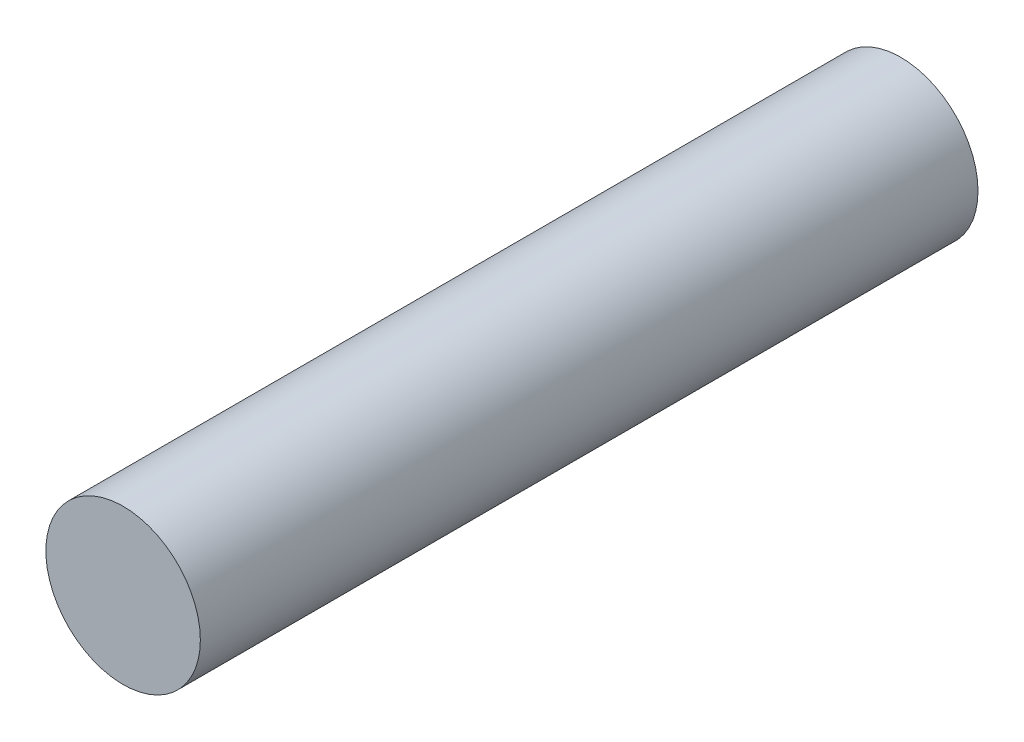
ISO-10303-21;
HEADER;
FILE_DESCRIPTION(('STEP AP214'),'2;1');
FILE_NAME('part.step','',(''),(''),'','','');
FILE_SCHEMA(('AUTOMOTIVE_DESIGN { 1 0 10303 214 1 1 1 1 }'));
ENDSEC;
DATA;
#1=APPLICATION_CONTEXT('core data for automotive mechanical design processes');
#2=APPLICATION_PROTOCOL_DEFINITION('international standard','automotive_design',2000,#1);
#3=PRODUCT_CONTEXT('',#1,'mechanical');
#4=PRODUCT('Part','Part','',(#3));
#5=PRODUCT_RELATED_PRODUCT_CATEGORY('part','',(#4));
#6=PRODUCT_DEFINITION_FORMATION('','',#4);
#7=PRODUCT_DEFINITION_CONTEXT('part definition',#1,'design');
#8=PRODUCT_DEFINITION('design','',#6,#7);
#9=PRODUCT_DEFINITION_SHAPE('','',#8);
#10=(LENGTH_UNIT() NAMED_UNIT(*) SI_UNIT(.MILLI.,.METRE.));
#11=(NAMED_UNIT(*) PLANE_ANGLE_UNIT() SI_UNIT($,.RADIAN.));
#12=(NAMED_UNIT(*) SI_UNIT($,.STERADIAN.) SOLID_ANGLE_UNIT());
#13=UNCERTAINTY_MEASURE_WITH_UNIT(LENGTH_MEASURE(1.E-05),#10,'distance_accuracy_value','');
#14=(GEOMETRIC_REPRESENTATION_CONTEXT(3) GLOBAL_UNCERTAINTY_ASSIGNED_CONTEXT((#13)) GLOBAL_UNIT_ASSIGNED_CONTEXT((#10,
#11,#12)) REPRESENTATION_CONTEXT('',''));
#15=CARTESIAN_POINT('',(0.,0.,0.));
#16=DIRECTION('',(0.,0.,1.));
#17=DIRECTION('',(1.,0.,0.));
#18=AXIS2_PLACEMENT_3D('',#15,#16,#17);
#19=CARTESIAN_POINT('',(0.,0.,15.));
#20=DIRECTION('',(0.,0.,-1.));
#21=DIRECTION('',(-1.,0.,0.));
#22=AXIS2_PLACEMENT_3D('',#19,#20,#21);
#23=CYLINDRICAL_SURFACE('',#22,1.49);
#24=CARTESIAN_POINT('',(0.,0.,15.));
#25=DIRECTION('',(0.,0.,1.));
#26=DIRECTION('',(1.,0.,0.));
#27=AXIS2_PLACEMENT_3D('',#24,#25,#26);
#28=CIRCLE('',#27,1.49);
#29=CARTESIAN_POINT('',(1.49,0.,15.));
#30=VERTEX_POINT('',#29);
#31=EDGE_CURVE('E10',#30,#30,#28,.T.);
#32=ORIENTED_EDGE('',*,*,#31,.F.);
#33=EDGE_LOOP('',(#32));
#34=FACE_BOUND('',#33,.T.);
#35=CARTESIAN_POINT('',(0.,0.,0.));
#36=DIRECTION('',(0.,0.,1.));
#37=DIRECTION('',(1.,0.,0.));
#38=AXIS2_PLACEMENT_3D('',#35,#36,#37);
#39=CIRCLE('',#38,1.49);
#40=CARTESIAN_POINT('',(1.49,0.,0.));
#41=VERTEX_POINT('',#40);
#42=EDGE_CURVE('E46',#41,#41,#39,.T.);
#43=ORIENTED_EDGE('',*,*,#42,.T.);
#44=EDGE_LOOP('',(#43));
#45=FACE_BOUND('',#44,.T.);
#46=ADVANCED_FACE('F43',(#34,#45),#23,.T.);
#47=CARTESIAN_POINT('',(0.,0.,15.));
#48=DIRECTION('',(0.,0.,1.));
#49=DIRECTION('',(1.,0.,0.));
#50=AXIS2_PLACEMENT_3D('',#47,#48,#49);
#51=PLANE('',#50);
#52=ORIENTED_EDGE('',*,*,#31,.T.);
#53=EDGE_LOOP('',(#52));
#54=FACE_BOUND('',#53,.T.);
#55=ADVANCED_FACE('F60',(#54),#51,.T.);
#56=CARTESIAN_POINT('',(0.,0.,0.));
#57=DIRECTION('',(0.,0.,1.));
#58=DIRECTION('',(1.,0.,0.));
#59=AXIS2_PLACEMENT_3D('',#56,#57,#58);
#60=PLANE('',#59);
#61=ORIENTED_EDGE('',*,*,#42,.F.);
#62=EDGE_LOOP('',(#61));
#63=FACE_BOUND('',#62,.T.);
#64=ADVANCED_FACE('F58',(#63),#60,.F.);
#65=CLOSED_SHELL('',(#46,#55,#64));
#66=MANIFOLD_SOLID_BREP('B2',#65);
#67=ADVANCED_BREP_SHAPE_REPRESENTATION('',(#18,#66),#14);
#68=SHAPE_DEFINITION_REPRESENTATION(#9,#67);
ENDSEC;
END-ISO-10303-21;
